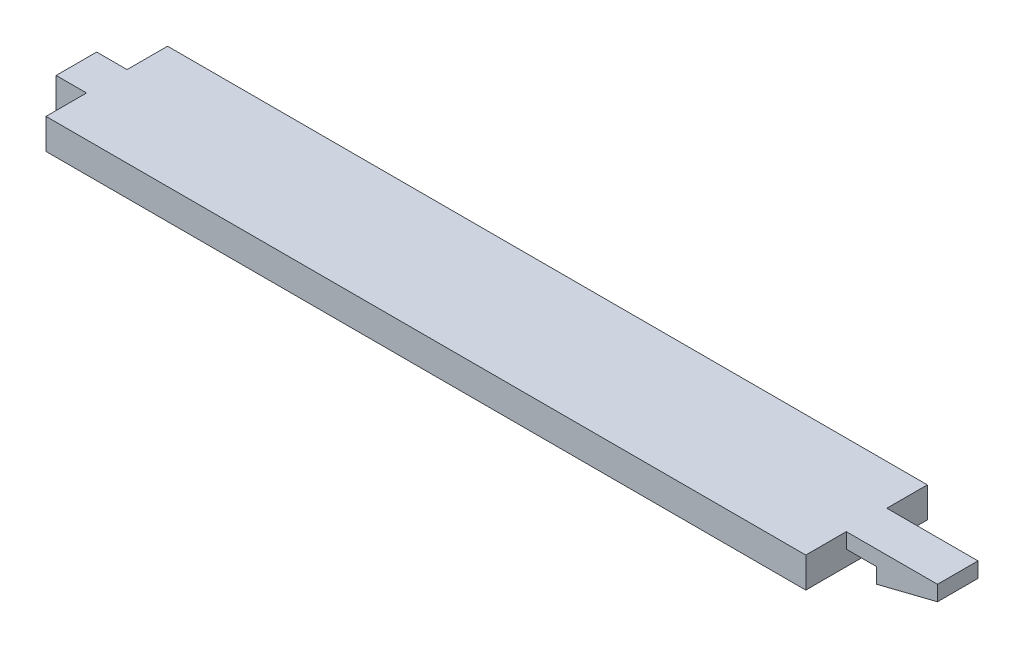
ISO-10303-21;
HEADER;
FILE_DESCRIPTION(('STEP AP214'),'2;1');
FILE_NAME('part.step','',(''),(''),'','','');
FILE_SCHEMA(('AUTOMOTIVE_DESIGN { 1 0 10303 214 1 1 1 1 }'));
ENDSEC;
DATA;
#1=APPLICATION_CONTEXT('core data for automotive mechanical design processes');
#2=APPLICATION_PROTOCOL_DEFINITION('international standard','automotive_design',2000,#1);
#3=PRODUCT_CONTEXT('',#1,'mechanical');
#4=PRODUCT('Part','Part','',(#3));
#5=PRODUCT_RELATED_PRODUCT_CATEGORY('part','',(#4));
#6=PRODUCT_DEFINITION_FORMATION('','',#4);
#7=PRODUCT_DEFINITION_CONTEXT('part definition',#1,'design');
#8=PRODUCT_DEFINITION('design','',#6,#7);
#9=PRODUCT_DEFINITION_SHAPE('','',#8);
#10=(LENGTH_UNIT() NAMED_UNIT(*) SI_UNIT(.MILLI.,.METRE.));
#11=(NAMED_UNIT(*) PLANE_ANGLE_UNIT() SI_UNIT($,.RADIAN.));
#12=(NAMED_UNIT(*) SI_UNIT($,.STERADIAN.) SOLID_ANGLE_UNIT());
#13=UNCERTAINTY_MEASURE_WITH_UNIT(LENGTH_MEASURE(1.E-05),#10,'distance_accuracy_value','');
#14=(GEOMETRIC_REPRESENTATION_CONTEXT(3) GLOBAL_UNCERTAINTY_ASSIGNED_CONTEXT((#13)) GLOBAL_UNIT_ASSIGNED_CONTEXT((#10,
#11,#12)) REPRESENTATION_CONTEXT('',''));
#15=CARTESIAN_POINT('',(0.,0.,0.));
#16=DIRECTION('',(0.,0.,1.));
#17=DIRECTION('',(1.,0.,0.));
#18=AXIS2_PLACEMENT_3D('',#15,#16,#17);
#19=CARTESIAN_POINT('',(0.,0.,0.));
#20=DIRECTION('',(0.,1.,0.));
#21=DIRECTION('',(0.,0.,1.));
#22=AXIS2_PLACEMENT_3D('',#19,#20,#21);
#23=PLANE('',#22);
#24=DIRECTION('',(-1.,0.,0.));
#25=VECTOR('',#24,1.);
#26=CARTESIAN_POINT('',(0.,0.,0.));
#27=LINE('',#26,#25);
#28=CARTESIAN_POINT('',(165.1,0.,0.));
#29=VERTEX_POINT('',#28);
#30=CARTESIAN_POINT('',(6.35,0.,0.));
#31=VERTEX_POINT('',#30);
#32=EDGE_CURVE('E211',#29,#31,#27,.T.);
#33=ORIENTED_EDGE('',*,*,#32,.F.);
#34=DIRECTION('',(0.,0.,1.));
#35=VECTOR('',#34,1.);
#36=CARTESIAN_POINT('',(165.1,0.,25.4));
#37=LINE('',#36,#35);
#38=CARTESIAN_POINT('',(165.1,0.,25.4));
#39=VERTEX_POINT('',#38);
#40=EDGE_CURVE('E236',#29,#39,#37,.T.);
#41=ORIENTED_EDGE('',*,*,#40,.T.);
#42=DIRECTION('',(1.,0.,0.));
#43=VECTOR('',#42,1.);
#44=CARTESIAN_POINT('',(0.,0.,25.4));
#45=LINE('',#44,#43);
#46=CARTESIAN_POINT('',(6.35,0.,25.4));
#47=VERTEX_POINT('',#46);
#48=EDGE_CURVE('E222',#47,#39,#45,.T.);
#49=ORIENTED_EDGE('',*,*,#48,.F.);
#50=DIRECTION('',(0.,0.,-1.));
#51=VECTOR('',#50,1.);
#52=CARTESIAN_POINT('',(6.35,0.,25.4));
#53=LINE('',#52,#51);
#54=CARTESIAN_POINT('',(6.35,0.,16.9333333333333));
#55=VERTEX_POINT('',#54);
#56=EDGE_CURVE('E189',#47,#55,#53,.T.);
#57=ORIENTED_EDGE('',*,*,#56,.T.);
#58=DIRECTION('',(-1.,0.,0.));
#59=VECTOR('',#58,1.);
#60=CARTESIAN_POINT('',(0.,0.,16.9333333333333));
#61=LINE('',#60,#59);
#62=CARTESIAN_POINT('',(0.,0.,16.9333333333333));
#63=VERTEX_POINT('',#62);
#64=EDGE_CURVE('E192',#55,#63,#61,.T.);
#65=ORIENTED_EDGE('',*,*,#64,.T.);
#66=DIRECTION('',(0.,0.,1.));
#67=VECTOR('',#66,1.);
#68=CARTESIAN_POINT('',(0.,0.,0.));
#69=LINE('',#68,#67);
#70=CARTESIAN_POINT('',(0.,0.,8.46666666666667));
#71=VERTEX_POINT('',#70);
#72=EDGE_CURVE('E185',#71,#63,#69,.T.);
#73=ORIENTED_EDGE('',*,*,#72,.F.);
#74=DIRECTION('',(1.,0.,0.));
#75=VECTOR('',#74,1.);
#76=CARTESIAN_POINT('',(0.,0.,8.46666666666667));
#77=LINE('',#76,#75);
#78=CARTESIAN_POINT('',(6.35,0.,8.46666666666667));
#79=VERTEX_POINT('',#78);
#80=EDGE_CURVE('E168',#71,#79,#77,.T.);
#81=ORIENTED_EDGE('',*,*,#80,.T.);
#82=DIRECTION('',(0.,0.,-1.));
#83=VECTOR('',#82,1.);
#84=CARTESIAN_POINT('',(6.35,0.,0.));
#85=LINE('',#84,#83);
#86=EDGE_CURVE('E171',#79,#31,#85,.T.);
#87=ORIENTED_EDGE('',*,*,#86,.T.);
#88=EDGE_LOOP('',(#33,#41,#49,#57,#65,#73,#81,#87));
#89=FACE_BOUND('',#88,.T.);
#90=ADVANCED_FACE('F33',(#89),#23,.F.);
#91=CARTESIAN_POINT('',(0.,6.35,0.));
#92=DIRECTION('',(1.,0.,0.));
#93=DIRECTION('',(0.,0.,-1.));
#94=AXIS2_PLACEMENT_3D('',#91,#92,#93);
#95=PLANE('',#94);
#96=DIRECTION('',(0.,0.,1.));
#97=VECTOR('',#96,1.);
#98=CARTESIAN_POINT('',(0.,6.35,0.));
#99=LINE('',#98,#97);
#100=CARTESIAN_POINT('',(0.,6.35,8.46666666666667));
#101=VERTEX_POINT('',#100);
#102=CARTESIAN_POINT('',(0.,6.35,16.9333333333333));
#103=VERTEX_POINT('',#102);
#104=EDGE_CURVE('E207',#101,#103,#99,.T.);
#105=ORIENTED_EDGE('',*,*,#104,.F.);
#106=DIRECTION('',(0.,1.,0.));
#107=VECTOR('',#106,1.);
#108=CARTESIAN_POINT('',(0.,0.,8.46666666666667));
#109=LINE('',#108,#107);
#110=EDGE_CURVE('E175',#71,#101,#109,.T.);
#111=ORIENTED_EDGE('',*,*,#110,.F.);
#112=ORIENTED_EDGE('',*,*,#72,.T.);
#113=DIRECTION('',(0.,1.,0.));
#114=VECTOR('',#113,1.);
#115=CARTESIAN_POINT('',(0.,0.,16.9333333333333));
#116=LINE('',#115,#114);
#117=EDGE_CURVE('E179',#63,#103,#116,.T.);
#118=ORIENTED_EDGE('',*,*,#117,.T.);
#119=EDGE_LOOP('',(#105,#111,#112,#118));
#120=FACE_BOUND('',#119,.T.);
#121=ADVANCED_FACE('F281',(#120),#95,.F.);
#122=CARTESIAN_POINT('',(0.,6.35,25.4));
#123=DIRECTION('',(0.,0.,-1.));
#124=DIRECTION('',(-1.,0.,0.));
#125=AXIS2_PLACEMENT_3D('',#122,#123,#124);
#126=PLANE('',#125);
#127=ORIENTED_EDGE('',*,*,#48,.T.);
#128=DIRECTION('',(0.,1.,0.));
#129=VECTOR('',#128,1.);
#130=CARTESIAN_POINT('',(165.1,0.,25.4));
#131=LINE('',#130,#129);
#132=CARTESIAN_POINT('',(165.1,6.35,25.4));
#133=VERTEX_POINT('',#132);
#134=EDGE_CURVE('E200',#39,#133,#131,.T.);
#135=ORIENTED_EDGE('',*,*,#134,.T.);
#136=DIRECTION('',(1.,0.,0.));
#137=VECTOR('',#136,1.);
#138=CARTESIAN_POINT('',(0.,6.35,25.4));
#139=LINE('',#138,#137);
#140=CARTESIAN_POINT('',(6.35,6.35,25.4));
#141=VERTEX_POINT('',#140);
#142=EDGE_CURVE('E210',#141,#133,#139,.T.);
#143=ORIENTED_EDGE('',*,*,#142,.F.);
#144=DIRECTION('',(0.,1.,0.));
#145=VECTOR('',#144,1.);
#146=CARTESIAN_POINT('',(6.35,0.,25.4));
#147=LINE('',#146,#145);
#148=EDGE_CURVE('E196',#47,#141,#147,.T.);
#149=ORIENTED_EDGE('',*,*,#148,.F.);
#150=EDGE_LOOP('',(#127,#135,#143,#149));
#151=FACE_BOUND('',#150,.T.);
#152=ADVANCED_FACE('F260',(#151),#126,.F.);
#153=CARTESIAN_POINT('',(184.15,6.35,0.));
#154=DIRECTION('',(-1.,0.,0.));
#155=DIRECTION('',(0.,0.,1.));
#156=AXIS2_PLACEMENT_3D('',#153,#154,#155);
#157=PLANE('',#156);
#158=DIRECTION('',(0.,1.,0.));
#159=VECTOR('',#158,1.);
#160=CARTESIAN_POINT('',(184.15,0.,16.9333333333333));
#161=LINE('',#160,#159);
#162=CARTESIAN_POINT('',(184.15,3.17499999999999,16.9333333333333));
#163=VERTEX_POINT('',#162);
#164=CARTESIAN_POINT('',(184.15,6.35,16.9333333333333));
#165=VERTEX_POINT('',#164);
#166=EDGE_CURVE('E239',#163,#165,#161,.T.);
#167=ORIENTED_EDGE('',*,*,#166,.F.);
#168=DIRECTION('',(0.,0.,-1.));
#169=VECTOR('',#168,1.);
#170=CARTESIAN_POINT('',(184.15,3.17499999999999,0.));
#171=LINE('',#170,#169);
#172=CARTESIAN_POINT('',(184.15,3.17499999999999,8.46666666666667));
#173=VERTEX_POINT('',#172);
#174=EDGE_CURVE('E219',#163,#173,#171,.T.);
#175=ORIENTED_EDGE('',*,*,#174,.T.);
#176=DIRECTION('',(0.,1.,0.));
#177=VECTOR('',#176,1.);
#178=CARTESIAN_POINT('',(184.15,0.,8.46666666666667));
#179=LINE('',#178,#177);
#180=CARTESIAN_POINT('',(184.15,6.35,8.46666666666667));
#181=VERTEX_POINT('',#180);
#182=EDGE_CURVE('E159',#173,#181,#179,.T.);
#183=ORIENTED_EDGE('',*,*,#182,.T.);
#184=DIRECTION('',(0.,0.,-1.));
#185=VECTOR('',#184,1.);
#186=CARTESIAN_POINT('',(184.15,6.35,0.));
#187=LINE('',#186,#185);
#188=EDGE_CURVE('E214',#165,#181,#187,.T.);
#189=ORIENTED_EDGE('',*,*,#188,.F.);
#190=EDGE_LOOP('',(#167,#175,#183,#189));
#191=FACE_BOUND('',#190,.T.);
#192=ADVANCED_FACE('F255',(#191),#157,.F.);
#193=CARTESIAN_POINT('',(0.,6.35,0.));
#194=DIRECTION('',(0.,0.,1.));
#195=DIRECTION('',(1.,0.,0.));
#196=AXIS2_PLACEMENT_3D('',#193,#194,#195);
#197=PLANE('',#196);
#198=DIRECTION('',(-1.,0.,0.));
#199=VECTOR('',#198,1.);
#200=CARTESIAN_POINT('',(0.,6.35,0.));
#201=LINE('',#200,#199);
#202=CARTESIAN_POINT('',(165.1,6.35,0.));
#203=VERTEX_POINT('',#202);
#204=CARTESIAN_POINT('',(6.35,6.35,0.));
#205=VERTEX_POINT('',#204);
#206=EDGE_CURVE('E217',#203,#205,#201,.T.);
#207=ORIENTED_EDGE('',*,*,#206,.F.);
#208=DIRECTION('',(0.,1.,0.));
#209=VECTOR('',#208,1.);
#210=CARTESIAN_POINT('',(165.1,0.,0.));
#211=LINE('',#210,#209);
#212=EDGE_CURVE('E160',#29,#203,#211,.T.);
#213=ORIENTED_EDGE('',*,*,#212,.F.);
#214=ORIENTED_EDGE('',*,*,#32,.T.);
#215=DIRECTION('',(0.,1.,0.));
#216=VECTOR('',#215,1.);
#217=CARTESIAN_POINT('',(6.35,0.,0.));
#218=LINE('',#217,#216);
#219=EDGE_CURVE('E182',#31,#205,#218,.T.);
#220=ORIENTED_EDGE('',*,*,#219,.T.);
#221=EDGE_LOOP('',(#207,#213,#214,#220));
#222=FACE_BOUND('',#221,.T.);
#223=ADVANCED_FACE('F268',(#222),#197,.F.);
#224=CARTESIAN_POINT('',(0.,6.35,0.));
#225=DIRECTION('',(0.,1.,0.));
#226=DIRECTION('',(0.,0.,1.));
#227=AXIS2_PLACEMENT_3D('',#224,#225,#226);
#228=PLANE('',#227);
#229=DIRECTION('',(0.,0.,1.));
#230=VECTOR('',#229,1.);
#231=CARTESIAN_POINT('',(165.1,6.35,25.4));
#232=LINE('',#231,#230);
#233=CARTESIAN_POINT('',(165.1,6.35,16.9333333333333));
#234=VERTEX_POINT('',#233);
#235=EDGE_CURVE('E240',#234,#133,#232,.T.);
#236=ORIENTED_EDGE('',*,*,#235,.F.);
#237=DIRECTION('',(-1.,0.,0.));
#238=VECTOR('',#237,1.);
#239=CARTESIAN_POINT('',(184.15,6.35,16.9333333333333));
#240=LINE('',#239,#238);
#241=EDGE_CURVE('E162',#165,#234,#240,.T.);
#242=ORIENTED_EDGE('',*,*,#241,.F.);
#243=ORIENTED_EDGE('',*,*,#188,.T.);
#244=DIRECTION('',(1.,0.,0.));
#245=VECTOR('',#244,1.);
#246=CARTESIAN_POINT('',(184.15,6.35,8.46666666666667));
#247=LINE('',#246,#245);
#248=CARTESIAN_POINT('',(165.1,6.35,8.46666666666667));
#249=VERTEX_POINT('',#248);
#250=EDGE_CURVE('E164',#249,#181,#247,.T.);
#251=ORIENTED_EDGE('',*,*,#250,.F.);
#252=DIRECTION('',(0.,0.,1.));
#253=VECTOR('',#252,1.);
#254=CARTESIAN_POINT('',(165.1,6.35,0.));
#255=LINE('',#254,#253);
#256=EDGE_CURVE('E157',#203,#249,#255,.T.);
#257=ORIENTED_EDGE('',*,*,#256,.F.);
#258=ORIENTED_EDGE('',*,*,#206,.T.);
#259=DIRECTION('',(0.,0.,-1.));
#260=VECTOR('',#259,1.);
#261=CARTESIAN_POINT('',(6.35,6.35,0.));
#262=LINE('',#261,#260);
#263=CARTESIAN_POINT('',(6.35,6.35,8.46666666666667));
#264=VERTEX_POINT('',#263);
#265=EDGE_CURVE('E172',#264,#205,#262,.T.);
#266=ORIENTED_EDGE('',*,*,#265,.F.);
#267=DIRECTION('',(1.,0.,0.));
#268=VECTOR('',#267,1.);
#269=CARTESIAN_POINT('',(0.,6.35,8.46666666666667));
#270=LINE('',#269,#268);
#271=EDGE_CURVE('E176',#101,#264,#270,.T.);
#272=ORIENTED_EDGE('',*,*,#271,.F.);
#273=ORIENTED_EDGE('',*,*,#104,.T.);
#274=DIRECTION('',(-1.,0.,0.));
#275=VECTOR('',#274,1.);
#276=CARTESIAN_POINT('',(0.,6.35,16.9333333333333));
#277=LINE('',#276,#275);
#278=CARTESIAN_POINT('',(6.35,6.35,16.9333333333333));
#279=VERTEX_POINT('',#278);
#280=EDGE_CURVE('E193',#279,#103,#277,.T.);
#281=ORIENTED_EDGE('',*,*,#280,.F.);
#282=DIRECTION('',(0.,0.,-1.));
#283=VECTOR('',#282,1.);
#284=CARTESIAN_POINT('',(6.35,6.35,25.4));
#285=LINE('',#284,#283);
#286=EDGE_CURVE('E197',#141,#279,#285,.T.);
#287=ORIENTED_EDGE('',*,*,#286,.F.);
#288=ORIENTED_EDGE('',*,*,#142,.T.);
#289=EDGE_LOOP('',(#236,#242,#243,#251,#257,#258,#266,#272,#273,#281,#287,#288));
#290=FACE_BOUND('',#289,.T.);
#291=ADVANCED_FACE('F253',(#290),#228,.T.);
#292=CARTESIAN_POINT('',(0.,0.,16.9333333333333));
#293=DIRECTION('',(0.,0.,-1.));
#294=DIRECTION('',(-1.,0.,0.));
#295=AXIS2_PLACEMENT_3D('',#292,#293,#294);
#296=PLANE('',#295);
#297=ORIENTED_EDGE('',*,*,#280,.T.);
#298=ORIENTED_EDGE('',*,*,#117,.F.);
#299=ORIENTED_EDGE('',*,*,#64,.F.);
#300=DIRECTION('',(0.,1.,0.));
#301=VECTOR('',#300,1.);
#302=CARTESIAN_POINT('',(6.35,0.,16.9333333333333));
#303=LINE('',#302,#301);
#304=EDGE_CURVE('E204',#55,#279,#303,.T.);
#305=ORIENTED_EDGE('',*,*,#304,.T.);
#306=EDGE_LOOP('',(#297,#298,#299,#305));
#307=FACE_BOUND('',#306,.T.);
#308=ADVANCED_FACE('F284',(#307),#296,.F.);
#309=CARTESIAN_POINT('',(6.35,0.,25.4));
#310=DIRECTION('',(1.,0.,0.));
#311=DIRECTION('',(0.,0.,-1.));
#312=AXIS2_PLACEMENT_3D('',#309,#310,#311);
#313=PLANE('',#312);
#314=ORIENTED_EDGE('',*,*,#286,.T.);
#315=ORIENTED_EDGE('',*,*,#304,.F.);
#316=ORIENTED_EDGE('',*,*,#56,.F.);
#317=ORIENTED_EDGE('',*,*,#148,.T.);
#318=EDGE_LOOP('',(#314,#315,#316,#317));
#319=FACE_BOUND('',#318,.T.);
#320=ADVANCED_FACE('F287',(#319),#313,.F.);
#321=CARTESIAN_POINT('',(6.35,0.,0.));
#322=DIRECTION('',(1.,0.,0.));
#323=DIRECTION('',(0.,0.,-1.));
#324=AXIS2_PLACEMENT_3D('',#321,#322,#323);
#325=PLANE('',#324);
#326=ORIENTED_EDGE('',*,*,#265,.T.);
#327=ORIENTED_EDGE('',*,*,#219,.F.);
#328=ORIENTED_EDGE('',*,*,#86,.F.);
#329=DIRECTION('',(0.,1.,0.));
#330=VECTOR('',#329,1.);
#331=CARTESIAN_POINT('',(6.35,0.,8.46666666666667));
#332=LINE('',#331,#330);
#333=EDGE_CURVE('E186',#79,#264,#332,.T.);
#334=ORIENTED_EDGE('',*,*,#333,.T.);
#335=EDGE_LOOP('',(#326,#327,#328,#334));
#336=FACE_BOUND('',#335,.T.);
#337=ADVANCED_FACE('F273',(#336),#325,.F.);
#338=CARTESIAN_POINT('',(0.,0.,8.46666666666667));
#339=DIRECTION('',(0.,0.,1.));
#340=DIRECTION('',(1.,0.,0.));
#341=AXIS2_PLACEMENT_3D('',#338,#339,#340);
#342=PLANE('',#341);
#343=ORIENTED_EDGE('',*,*,#271,.T.);
#344=ORIENTED_EDGE('',*,*,#333,.F.);
#345=ORIENTED_EDGE('',*,*,#80,.F.);
#346=ORIENTED_EDGE('',*,*,#110,.T.);
#347=EDGE_LOOP('',(#343,#344,#345,#346));
#348=FACE_BOUND('',#347,.T.);
#349=ADVANCED_FACE('F276',(#348),#342,.F.);
#350=CARTESIAN_POINT('',(184.15,0.,8.46666666666667));
#351=DIRECTION('',(0.,0.,1.));
#352=DIRECTION('',(1.,0.,0.));
#353=AXIS2_PLACEMENT_3D('',#350,#351,#352);
#354=PLANE('',#353);
#355=ORIENTED_EDGE('',*,*,#182,.F.);
#356=DIRECTION('',(0.970142500145333,0.24253562503633,0.));
#357=VECTOR('',#356,1.);
#358=CARTESIAN_POINT('',(184.15,3.17499999999999,8.46666666666667));
#359=LINE('',#358,#357);
#360=CARTESIAN_POINT('',(171.45,0.,8.46666666666667));
#361=VERTEX_POINT('',#360);
#362=EDGE_CURVE('E41',#173,#361,#359,.F.);
#363=ORIENTED_EDGE('',*,*,#362,.T.);
#364=DIRECTION('',(0.,-1.,0.));
#365=VECTOR('',#364,1.);
#366=CARTESIAN_POINT('',(171.45,3.175,8.46666666666667));
#367=LINE('',#366,#365);
#368=CARTESIAN_POINT('',(171.45,3.175,8.46666666666667));
#369=VERTEX_POINT('',#368);
#370=EDGE_CURVE('E152',#369,#361,#367,.T.);
#371=ORIENTED_EDGE('',*,*,#370,.F.);
#372=DIRECTION('',(1.,0.,0.));
#373=VECTOR('',#372,1.);
#374=CARTESIAN_POINT('',(165.1,3.175,8.46666666666667));
#375=LINE('',#374,#373);
#376=CARTESIAN_POINT('',(165.1,3.175,8.46666666666667));
#377=VERTEX_POINT('',#376);
#378=EDGE_CURVE('E136',#377,#369,#375,.T.);
#379=ORIENTED_EDGE('',*,*,#378,.F.);
#380=DIRECTION('',(0.,1.,0.));
#381=VECTOR('',#380,1.);
#382=CARTESIAN_POINT('',(165.1,0.,8.46666666666667));
#383=LINE('',#382,#381);
#384=EDGE_CURVE('E149',#377,#249,#383,.T.);
#385=ORIENTED_EDGE('',*,*,#384,.T.);
#386=ORIENTED_EDGE('',*,*,#250,.T.);
#387=EDGE_LOOP('',(#355,#363,#371,#379,#385,#386));
#388=FACE_BOUND('',#387,.T.);
#389=ADVANCED_FACE('F147',(#388),#354,.F.);
#390=CARTESIAN_POINT('',(165.1,0.,25.4));
#391=DIRECTION('',(-1.,0.,0.));
#392=DIRECTION('',(0.,0.,1.));
#393=AXIS2_PLACEMENT_3D('',#390,#391,#392);
#394=PLANE('',#393);
#395=ORIENTED_EDGE('',*,*,#235,.T.);
#396=ORIENTED_EDGE('',*,*,#134,.F.);
#397=ORIENTED_EDGE('',*,*,#40,.F.);
#398=ORIENTED_EDGE('',*,*,#212,.T.);
#399=ORIENTED_EDGE('',*,*,#256,.T.);
#400=ORIENTED_EDGE('',*,*,#384,.F.);
#401=DIRECTION('',(0.,0.,-1.));
#402=VECTOR('',#401,1.);
#403=CARTESIAN_POINT('',(165.1,3.175,8.46666666666667));
#404=LINE('',#403,#402);
#405=CARTESIAN_POINT('',(165.1,3.175,16.9333333333333));
#406=VERTEX_POINT('',#405);
#407=EDGE_CURVE('E133',#406,#377,#404,.T.);
#408=ORIENTED_EDGE('',*,*,#407,.F.);
#409=DIRECTION('',(0.,1.,0.));
#410=VECTOR('',#409,1.);
#411=CARTESIAN_POINT('',(165.1,0.,16.9333333333333));
#412=LINE('',#411,#410);
#413=EDGE_CURVE('E246',#406,#234,#412,.T.);
#414=ORIENTED_EDGE('',*,*,#413,.T.);
#415=EDGE_LOOP('',(#395,#396,#397,#398,#399,#400,#408,#414));
#416=FACE_BOUND('',#415,.T.);
#417=ADVANCED_FACE('F155',(#416),#394,.F.);
#418=CARTESIAN_POINT('',(184.15,0.,16.9333333333333));
#419=DIRECTION('',(0.,0.,-1.));
#420=DIRECTION('',(-1.,0.,0.));
#421=AXIS2_PLACEMENT_3D('',#418,#419,#420);
#422=PLANE('',#421);
#423=DIRECTION('',(0.,-1.,0.));
#424=VECTOR('',#423,1.);
#425=CARTESIAN_POINT('',(171.45,3.175,16.9333333333333));
#426=LINE('',#425,#424);
#427=CARTESIAN_POINT('',(171.45,3.175,16.9333333333333));
#428=VERTEX_POINT('',#427);
#429=CARTESIAN_POINT('',(171.45,0.,16.9333333333333));
#430=VERTEX_POINT('',#429);
#431=EDGE_CURVE('E229',#428,#430,#426,.T.);
#432=ORIENTED_EDGE('',*,*,#431,.T.);
#433=DIRECTION('',(-0.970142500145333,-0.24253562503633,0.));
#434=VECTOR('',#433,1.);
#435=CARTESIAN_POINT('',(184.15,3.17499999999999,16.9333333333333));
#436=LINE('',#435,#434);
#437=EDGE_CURVE('E11',#430,#163,#436,.F.);
#438=ORIENTED_EDGE('',*,*,#437,.T.);
#439=ORIENTED_EDGE('',*,*,#166,.T.);
#440=ORIENTED_EDGE('',*,*,#241,.T.);
#441=ORIENTED_EDGE('',*,*,#413,.F.);
#442=DIRECTION('',(-1.,0.,0.));
#443=VECTOR('',#442,1.);
#444=CARTESIAN_POINT('',(165.1,3.175,16.9333333333333));
#445=LINE('',#444,#443);
#446=EDGE_CURVE('E139',#428,#406,#445,.T.);
#447=ORIENTED_EDGE('',*,*,#446,.F.);
#448=EDGE_LOOP('',(#432,#438,#439,#440,#441,#447));
#449=FACE_BOUND('',#448,.T.);
#450=ADVANCED_FACE('F256',(#449),#422,.F.);
#451=CARTESIAN_POINT('',(171.45,3.175,8.46666666666667));
#452=DIRECTION('',(1.,0.,0.));
#453=DIRECTION('',(0.,0.,-1.));
#454=AXIS2_PLACEMENT_3D('',#451,#452,#453);
#455=PLANE('',#454);
#456=DIRECTION('',(0.,0.,1.));
#457=VECTOR('',#456,1.);
#458=CARTESIAN_POINT('',(171.45,0.,8.46666666666667));
#459=LINE('',#458,#457);
#460=EDGE_CURVE('E143',#361,#430,#459,.T.);
#461=ORIENTED_EDGE('',*,*,#460,.T.);
#462=ORIENTED_EDGE('',*,*,#431,.F.);
#463=DIRECTION('',(0.,0.,1.));
#464=VECTOR('',#463,1.);
#465=CARTESIAN_POINT('',(171.45,3.175,8.46666666666667));
#466=LINE('',#465,#464);
#467=EDGE_CURVE('E153',#369,#428,#466,.T.);
#468=ORIENTED_EDGE('',*,*,#467,.F.);
#469=ORIENTED_EDGE('',*,*,#370,.T.);
#470=EDGE_LOOP('',(#461,#462,#468,#469));
#471=FACE_BOUND('',#470,.T.);
#472=ADVANCED_FACE('F227',(#471),#455,.F.);
#473=CARTESIAN_POINT('',(0.,3.175,0.));
#474=DIRECTION('',(0.,1.,0.));
#475=DIRECTION('',(0.,0.,1.));
#476=AXIS2_PLACEMENT_3D('',#473,#474,#475);
#477=PLANE('',#476);
#478=ORIENTED_EDGE('',*,*,#407,.T.);
#479=ORIENTED_EDGE('',*,*,#378,.T.);
#480=ORIENTED_EDGE('',*,*,#467,.T.);
#481=ORIENTED_EDGE('',*,*,#446,.T.);
#482=EDGE_LOOP('',(#478,#479,#480,#481));
#483=FACE_BOUND('',#482,.T.);
#484=ADVANCED_FACE('F135',(#483),#477,.F.);
#485=CARTESIAN_POINT('',(184.15,3.17499999999999,0.));
#486=DIRECTION('',(-0.24253562503633,0.970142500145333,0.));
#487=DIRECTION('',(0.,0.,-1.));
#488=AXIS2_PLACEMENT_3D('',#485,#486,#487);
#489=PLANE('',#488);
#490=ORIENTED_EDGE('',*,*,#437,.F.);
#491=ORIENTED_EDGE('',*,*,#460,.F.);
#492=ORIENTED_EDGE('',*,*,#362,.F.);
#493=ORIENTED_EDGE('',*,*,#174,.F.);
#494=EDGE_LOOP('',(#490,#491,#492,#493));
#495=FACE_BOUND('',#494,.T.);
#496=ADVANCED_FACE('F35',(#495),#489,.F.);
#497=CLOSED_SHELL('',(#90,#121,#152,#192,#223,#291,#308,#320,#337,#349,#389,#417,#450,#472,#484,#496));
#498=MANIFOLD_SOLID_BREP('B2',#497);
#499=ADVANCED_BREP_SHAPE_REPRESENTATION('',(#18,#498),#14);
#500=SHAPE_DEFINITION_REPRESENTATION(#9,#499);
ENDSEC;
END-ISO-10303-21;
